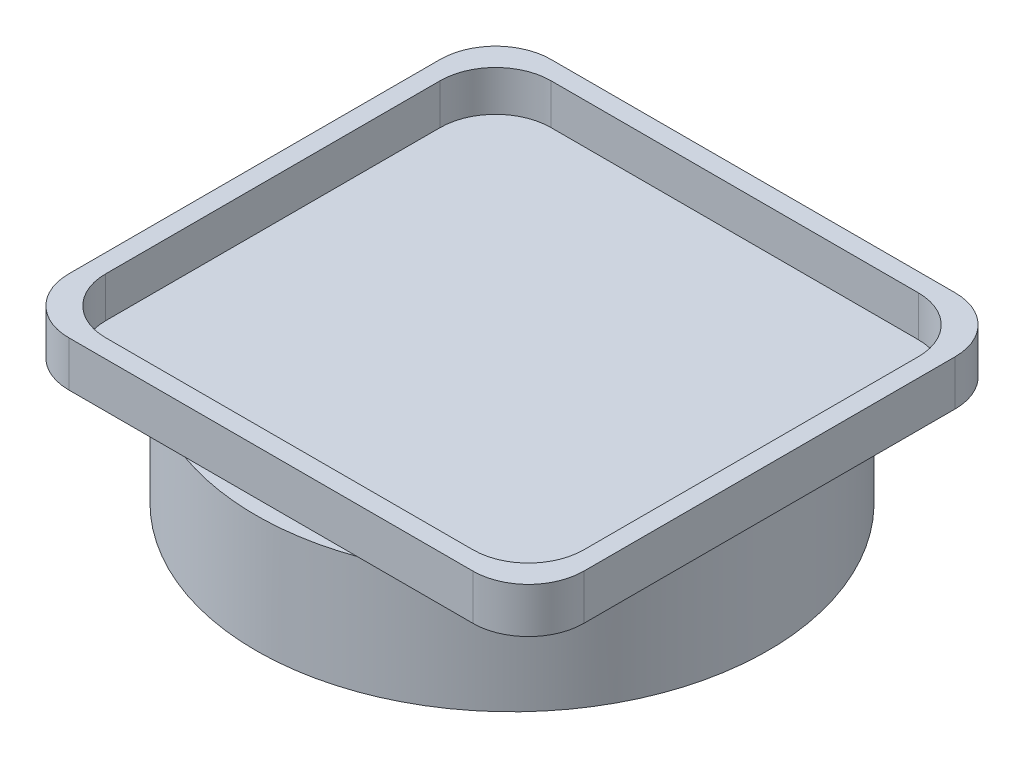
ISO-10303-21;
HEADER;
FILE_DESCRIPTION(('STEP AP214'),'2;1');
FILE_NAME('part.step','',(''),(''),'','','');
FILE_SCHEMA(('AUTOMOTIVE_DESIGN { 1 0 10303 214 1 1 1 1 }'));
ENDSEC;
DATA;
#1=APPLICATION_CONTEXT('core data for automotive mechanical design processes');
#2=APPLICATION_PROTOCOL_DEFINITION('international standard','automotive_design',2000,#1);
#3=PRODUCT_CONTEXT('',#1,'mechanical');
#4=PRODUCT('Part','Part','',(#3));
#5=PRODUCT_RELATED_PRODUCT_CATEGORY('part','',(#4));
#6=PRODUCT_DEFINITION_FORMATION('','',#4);
#7=PRODUCT_DEFINITION_CONTEXT('part definition',#1,'design');
#8=PRODUCT_DEFINITION('design','',#6,#7);
#9=PRODUCT_DEFINITION_SHAPE('','',#8);
#10=(LENGTH_UNIT() NAMED_UNIT(*) SI_UNIT(.MILLI.,.METRE.));
#11=(NAMED_UNIT(*) PLANE_ANGLE_UNIT() SI_UNIT($,.RADIAN.));
#12=(NAMED_UNIT(*) SI_UNIT($,.STERADIAN.) SOLID_ANGLE_UNIT());
#13=UNCERTAINTY_MEASURE_WITH_UNIT(LENGTH_MEASURE(1.E-05),#10,'distance_accuracy_value','');
#14=(GEOMETRIC_REPRESENTATION_CONTEXT(3) GLOBAL_UNCERTAINTY_ASSIGNED_CONTEXT((#13)) GLOBAL_UNIT_ASSIGNED_CONTEXT((#10,
#11,#12)) REPRESENTATION_CONTEXT('',''));
#15=CARTESIAN_POINT('',(0.,0.,0.));
#16=DIRECTION('',(0.,0.,1.));
#17=DIRECTION('',(1.,0.,0.));
#18=AXIS2_PLACEMENT_3D('',#15,#16,#17);
#19=CARTESIAN_POINT('',(10.955,-0.252,10.065));
#20=DIRECTION('',(0.,-1.,0.));
#21=DIRECTION('',(0.,0.,-1.));
#22=AXIS2_PLACEMENT_3D('',#19,#20,#21);
#23=PLANE('',#22);
#24=CARTESIAN_POINT('',(0.,-0.252,0.));
#25=DIRECTION('',(0.,-1.,0.));
#26=DIRECTION('',(0.,0.,-1.));
#27=AXIS2_PLACEMENT_3D('',#24,#25,#26);
#28=CIRCLE('',#27,13.875);
#29=CARTESIAN_POINT('',(4.67133813804996,-0.252,-13.065));
#30=VERTEX_POINT('',#29);
#31=CARTESIAN_POINT('',(4.67133813804995,-0.252,13.065));
#32=VERTEX_POINT('',#31);
#33=EDGE_CURVE('E49',#30,#32,#28,.T.);
#34=ORIENTED_EDGE('',*,*,#33,.F.);
#35=DIRECTION('',(1.,0.,0.));
#36=VECTOR('',#35,1.);
#37=CARTESIAN_POINT('',(-10.955,-0.252,-13.065));
#38=LINE('',#37,#36);
#39=CARTESIAN_POINT('',(10.955,-0.252,-13.065));
#40=VERTEX_POINT('',#39);
#41=EDGE_CURVE('E174',#30,#40,#38,.T.);
#42=ORIENTED_EDGE('',*,*,#41,.T.);
#43=CARTESIAN_POINT('',(10.955,-0.252,-10.065));
#44=DIRECTION('',(0.,-1.,0.));
#45=DIRECTION('',(0.,0.,-1.));
#46=AXIS2_PLACEMENT_3D('',#43,#44,#45);
#47=CIRCLE('',#46,3.);
#48=CARTESIAN_POINT('',(13.955,-0.252,-10.065));
#49=VERTEX_POINT('',#48);
#50=EDGE_CURVE('E171',#40,#49,#47,.T.);
#51=ORIENTED_EDGE('',*,*,#50,.T.);
#52=DIRECTION('',(0.,0.,1.));
#53=VECTOR('',#52,1.);
#54=CARTESIAN_POINT('',(13.955,-0.252,-10.065));
#55=LINE('',#54,#53);
#56=CARTESIAN_POINT('',(13.955,-0.252,10.065));
#57=VERTEX_POINT('',#56);
#58=EDGE_CURVE('E208',#49,#57,#55,.T.);
#59=ORIENTED_EDGE('',*,*,#58,.T.);
#60=CARTESIAN_POINT('',(10.955,-0.252,10.065));
#61=DIRECTION('',(0.,-1.,0.));
#62=DIRECTION('',(0.,0.,-1.));
#63=AXIS2_PLACEMENT_3D('',#60,#61,#62);
#64=CIRCLE('',#63,3.);
#65=CARTESIAN_POINT('',(10.955,-0.252,13.065));
#66=VERTEX_POINT('',#65);
#67=EDGE_CURVE('E193',#57,#66,#64,.T.);
#68=ORIENTED_EDGE('',*,*,#67,.T.);
#69=DIRECTION('',(-1.,0.,0.));
#70=VECTOR('',#69,1.);
#71=CARTESIAN_POINT('',(10.955,-0.252,13.065));
#72=LINE('',#71,#70);
#73=EDGE_CURVE('E197',#66,#32,#72,.T.);
#74=ORIENTED_EDGE('',*,*,#73,.T.);
#75=EDGE_LOOP('',(#34,#42,#51,#59,#68,#74));
#76=FACE_BOUND('',#75,.T.);
#77=ADVANCED_FACE('F39',(#76),#23,.T.);
#78=CARTESIAN_POINT('',(0.,2.2,0.));
#79=DIRECTION('',(0.,-1.,0.));
#80=DIRECTION('',(0.,0.,-1.));
#81=AXIS2_PLACEMENT_3D('',#78,#79,#80);
#82=PLANE('',#81);
#83=DIRECTION('',(0.,0.,1.));
#84=VECTOR('',#83,1.);
#85=CARTESIAN_POINT('',(-13.955,2.2,13.065));
#86=LINE('',#85,#84);
#87=CARTESIAN_POINT('',(-13.955,2.2,-10.065));
#88=VERTEX_POINT('',#87);
#89=CARTESIAN_POINT('',(-13.955,2.2,10.065));
#90=VERTEX_POINT('',#89);
#91=EDGE_CURVE('E225',#88,#90,#86,.T.);
#92=ORIENTED_EDGE('',*,*,#91,.T.);
#93=CARTESIAN_POINT('',(-10.955,2.2,10.065));
#94=DIRECTION('',(0.,-1.,0.));
#95=DIRECTION('',(0.,0.,-1.));
#96=AXIS2_PLACEMENT_3D('',#93,#94,#95);
#97=CIRCLE('',#96,3.);
#98=CARTESIAN_POINT('',(-10.955,2.2,13.065));
#99=VERTEX_POINT('',#98);
#100=EDGE_CURVE('E272',#90,#99,#97,.F.);
#101=ORIENTED_EDGE('',*,*,#100,.T.);
#102=DIRECTION('',(1.,0.,0.));
#103=VECTOR('',#102,1.);
#104=CARTESIAN_POINT('',(-13.955,2.2,13.065));
#105=LINE('',#104,#103);
#106=CARTESIAN_POINT('',(10.955,2.2,13.065));
#107=VERTEX_POINT('',#106);
#108=EDGE_CURVE('E238',#99,#107,#105,.T.);
#109=ORIENTED_EDGE('',*,*,#108,.T.);
#110=CARTESIAN_POINT('',(10.955,2.2,10.065));
#111=DIRECTION('',(0.,-1.,0.));
#112=DIRECTION('',(0.,0.,-1.));
#113=AXIS2_PLACEMENT_3D('',#110,#111,#112);
#114=CIRCLE('',#113,3.);
#115=CARTESIAN_POINT('',(13.955,2.2,10.065));
#116=VERTEX_POINT('',#115);
#117=EDGE_CURVE('E270',#107,#116,#114,.F.);
#118=ORIENTED_EDGE('',*,*,#117,.T.);
#119=DIRECTION('',(0.,0.,-1.));
#120=VECTOR('',#119,1.);
#121=CARTESIAN_POINT('',(13.955,2.2,13.065));
#122=LINE('',#121,#120);
#123=CARTESIAN_POINT('',(13.955,2.2,-10.065));
#124=VERTEX_POINT('',#123);
#125=EDGE_CURVE('E241',#116,#124,#122,.T.);
#126=ORIENTED_EDGE('',*,*,#125,.T.);
#127=CARTESIAN_POINT('',(10.955,2.2,-10.065));
#128=DIRECTION('',(0.,-1.,0.));
#129=DIRECTION('',(0.,0.,-1.));
#130=AXIS2_PLACEMENT_3D('',#127,#128,#129);
#131=CIRCLE('',#130,3.);
#132=CARTESIAN_POINT('',(10.955,2.2,-13.065));
#133=VERTEX_POINT('',#132);
#134=EDGE_CURVE('E268',#124,#133,#131,.F.);
#135=ORIENTED_EDGE('',*,*,#134,.T.);
#136=DIRECTION('',(-1.,0.,0.));
#137=VECTOR('',#136,1.);
#138=CARTESIAN_POINT('',(-13.955,2.2,-13.065));
#139=LINE('',#138,#137);
#140=CARTESIAN_POINT('',(-10.955,2.2,-13.065));
#141=VERTEX_POINT('',#140);
#142=EDGE_CURVE('E244',#133,#141,#139,.T.);
#143=ORIENTED_EDGE('',*,*,#142,.T.);
#144=CARTESIAN_POINT('',(-10.955,2.2,-10.065));
#145=DIRECTION('',(0.,-1.,0.));
#146=DIRECTION('',(0.,0.,-1.));
#147=AXIS2_PLACEMENT_3D('',#144,#145,#146);
#148=CIRCLE('',#147,3.);
#149=EDGE_CURVE('E266',#141,#88,#148,.F.);
#150=ORIENTED_EDGE('',*,*,#149,.T.);
#151=EDGE_LOOP('',(#92,#101,#109,#118,#126,#135,#143,#150));
#152=FACE_BOUND('',#151,.T.);
#153=DIRECTION('',(0.,0.,-1.));
#154=VECTOR('',#153,1.);
#155=CARTESIAN_POINT('',(12.955,2.2,12.065));
#156=LINE('',#155,#154);
#157=CARTESIAN_POINT('',(12.955,2.2,9.065));
#158=VERTEX_POINT('',#157);
#159=CARTESIAN_POINT('',(12.955,2.2,-9.06499999999999));
#160=VERTEX_POINT('',#159);
#161=EDGE_CURVE('E212',#158,#160,#156,.T.);
#162=ORIENTED_EDGE('',*,*,#161,.F.);
#163=CARTESIAN_POINT('',(9.955,2.2,9.065));
#164=DIRECTION('',(0.,-1.,0.));
#165=DIRECTION('',(0.,0.,-1.));
#166=AXIS2_PLACEMENT_3D('',#163,#164,#165);
#167=CIRCLE('',#166,3.);
#168=CARTESIAN_POINT('',(9.95499999999999,2.2,12.065));
#169=VERTEX_POINT('',#168);
#170=EDGE_CURVE('E300',#158,#169,#167,.T.);
#171=ORIENTED_EDGE('',*,*,#170,.T.);
#172=DIRECTION('',(1.,0.,0.));
#173=VECTOR('',#172,1.);
#174=CARTESIAN_POINT('',(-12.955,2.2,12.065));
#175=LINE('',#174,#173);
#176=CARTESIAN_POINT('',(-9.955,2.2,12.065));
#177=VERTEX_POINT('',#176);
#178=EDGE_CURVE('E222',#177,#169,#175,.T.);
#179=ORIENTED_EDGE('',*,*,#178,.F.);
#180=CARTESIAN_POINT('',(-9.955,2.2,9.065));
#181=DIRECTION('',(0.,-1.,0.));
#182=DIRECTION('',(0.,0.,-1.));
#183=AXIS2_PLACEMENT_3D('',#180,#181,#182);
#184=CIRCLE('',#183,3.);
#185=CARTESIAN_POINT('',(-12.955,2.2,9.065));
#186=VERTEX_POINT('',#185);
#187=EDGE_CURVE('E295',#177,#186,#184,.T.);
#188=ORIENTED_EDGE('',*,*,#187,.T.);
#189=DIRECTION('',(0.,0.,1.));
#190=VECTOR('',#189,1.);
#191=CARTESIAN_POINT('',(-12.955,2.2,12.065));
#192=LINE('',#191,#190);
#193=CARTESIAN_POINT('',(-12.955,2.2,-9.06499999999999));
#194=VERTEX_POINT('',#193);
#195=EDGE_CURVE('E219',#194,#186,#192,.T.);
#196=ORIENTED_EDGE('',*,*,#195,.F.);
#197=CARTESIAN_POINT('',(-9.955,2.2,-9.065));
#198=DIRECTION('',(0.,-1.,0.));
#199=DIRECTION('',(0.,0.,-1.));
#200=AXIS2_PLACEMENT_3D('',#197,#198,#199);
#201=CIRCLE('',#200,3.);
#202=CARTESIAN_POINT('',(-9.955,2.2,-12.065));
#203=VERTEX_POINT('',#202);
#204=EDGE_CURVE('E43',#194,#203,#201,.T.);
#205=ORIENTED_EDGE('',*,*,#204,.T.);
#206=DIRECTION('',(-1.,0.,0.));
#207=VECTOR('',#206,1.);
#208=CARTESIAN_POINT('',(-12.955,2.2,-12.065));
#209=LINE('',#208,#207);
#210=CARTESIAN_POINT('',(9.95499999999999,2.2,-12.065));
#211=VERTEX_POINT('',#210);
#212=EDGE_CURVE('E215',#211,#203,#209,.T.);
#213=ORIENTED_EDGE('',*,*,#212,.F.);
#214=CARTESIAN_POINT('',(9.955,2.2,-9.06499999999999));
#215=DIRECTION('',(0.,-1.,0.));
#216=DIRECTION('',(0.,0.,-1.));
#217=AXIS2_PLACEMENT_3D('',#214,#215,#216);
#218=CIRCLE('',#217,3.);
#219=EDGE_CURVE('E305',#211,#160,#218,.T.);
#220=ORIENTED_EDGE('',*,*,#219,.T.);
#221=EDGE_LOOP('',(#162,#171,#179,#188,#196,#205,#213,#220));
#222=FACE_BOUND('',#221,.T.);
#223=ADVANCED_FACE('F314',(#152,#222),#82,.F.);
#224=CARTESIAN_POINT('',(-13.955,2.2,13.065));
#225=DIRECTION('',(1.,0.,0.));
#226=DIRECTION('',(0.,0.,-1.));
#227=AXIS2_PLACEMENT_3D('',#224,#225,#226);
#228=PLANE('',#227);
#229=DIRECTION('',(0.,-1.,0.));
#230=VECTOR('',#229,1.);
#231=CARTESIAN_POINT('',(-13.955,2.2,-10.065));
#232=LINE('',#231,#230);
#233=CARTESIAN_POINT('',(-13.955,-0.252,-10.065));
#234=VERTEX_POINT('',#233);
#235=EDGE_CURVE('E262',#88,#234,#232,.T.);
#236=ORIENTED_EDGE('',*,*,#235,.T.);
#237=DIRECTION('',(0.,0.,-1.));
#238=VECTOR('',#237,1.);
#239=CARTESIAN_POINT('',(-13.955,-0.252,10.065));
#240=LINE('',#239,#238);
#241=CARTESIAN_POINT('',(-13.955,-0.252,10.065));
#242=VERTEX_POINT('',#241);
#243=EDGE_CURVE('E203',#242,#234,#240,.T.);
#244=ORIENTED_EDGE('',*,*,#243,.F.);
#245=DIRECTION('',(0.,-1.,0.));
#246=VECTOR('',#245,1.);
#247=CARTESIAN_POINT('',(-13.955,2.2,10.065));
#248=LINE('',#247,#246);
#249=EDGE_CURVE('E264',#242,#90,#248,.F.);
#250=ORIENTED_EDGE('',*,*,#249,.T.);
#251=ORIENTED_EDGE('',*,*,#91,.F.);
#252=EDGE_LOOP('',(#236,#244,#250,#251));
#253=FACE_BOUND('',#252,.T.);
#254=ADVANCED_FACE('F360',(#253),#228,.F.);
#255=CARTESIAN_POINT('',(-13.955,2.2,13.065));
#256=DIRECTION('',(0.,0.,-1.));
#257=DIRECTION('',(-1.,0.,0.));
#258=AXIS2_PLACEMENT_3D('',#255,#256,#257);
#259=PLANE('',#258);
#260=ORIENTED_EDGE('',*,*,#108,.F.);
#261=DIRECTION('',(0.,-1.,0.));
#262=VECTOR('',#261,1.);
#263=CARTESIAN_POINT('',(-10.955,2.2,13.065));
#264=LINE('',#263,#262);
#265=CARTESIAN_POINT('',(-10.955,-0.252,13.065));
#266=VERTEX_POINT('',#265);
#267=EDGE_CURVE('E259',#99,#266,#264,.T.);
#268=ORIENTED_EDGE('',*,*,#267,.T.);
#269=CARTESIAN_POINT('',(-4.67133813804995,-0.252,13.065));
#270=VERTEX_POINT('',#269);
#271=EDGE_CURVE('E196',#270,#266,#72,.T.);
#272=ORIENTED_EDGE('',*,*,#271,.F.);
#273=EDGE_CURVE('E200',#32,#270,#72,.T.);
#274=ORIENTED_EDGE('',*,*,#273,.F.);
#275=ORIENTED_EDGE('',*,*,#73,.F.);
#276=DIRECTION('',(0.,-1.,0.));
#277=VECTOR('',#276,1.);
#278=CARTESIAN_POINT('',(10.955,2.2,13.065));
#279=LINE('',#278,#277);
#280=EDGE_CURVE('E257',#66,#107,#279,.F.);
#281=ORIENTED_EDGE('',*,*,#280,.T.);
#282=EDGE_LOOP('',(#260,#268,#272,#274,#275,#281));
#283=FACE_BOUND('',#282,.T.);
#284=ADVANCED_FACE('F389',(#283),#259,.F.);
#285=CARTESIAN_POINT('',(13.955,2.2,13.065));
#286=DIRECTION('',(-1.,0.,0.));
#287=DIRECTION('',(0.,0.,1.));
#288=AXIS2_PLACEMENT_3D('',#285,#286,#287);
#289=PLANE('',#288);
#290=ORIENTED_EDGE('',*,*,#125,.F.);
#291=DIRECTION('',(0.,-1.,0.));
#292=VECTOR('',#291,1.);
#293=CARTESIAN_POINT('',(13.955,2.2,10.065));
#294=LINE('',#293,#292);
#295=EDGE_CURVE('E276',#116,#57,#294,.T.);
#296=ORIENTED_EDGE('',*,*,#295,.T.);
#297=ORIENTED_EDGE('',*,*,#58,.F.);
#298=DIRECTION('',(0.,-1.,0.));
#299=VECTOR('',#298,1.);
#300=CARTESIAN_POINT('',(13.955,2.2,-10.065));
#301=LINE('',#300,#299);
#302=EDGE_CURVE('E274',#49,#124,#301,.F.);
#303=ORIENTED_EDGE('',*,*,#302,.T.);
#304=EDGE_LOOP('',(#290,#296,#297,#303));
#305=FACE_BOUND('',#304,.T.);
#306=ADVANCED_FACE('F386',(#305),#289,.F.);
#307=CARTESIAN_POINT('',(-13.955,2.2,-13.065));
#308=DIRECTION('',(0.,0.,1.));
#309=DIRECTION('',(1.,0.,0.));
#310=AXIS2_PLACEMENT_3D('',#307,#308,#309);
#311=PLANE('',#310);
#312=ORIENTED_EDGE('',*,*,#142,.F.);
#313=DIRECTION('',(0.,-1.,0.));
#314=VECTOR('',#313,1.);
#315=CARTESIAN_POINT('',(10.955,2.2,-13.065));
#316=LINE('',#315,#314);
#317=EDGE_CURVE('E290',#133,#40,#316,.T.);
#318=ORIENTED_EDGE('',*,*,#317,.T.);
#319=ORIENTED_EDGE('',*,*,#41,.F.);
#320=CARTESIAN_POINT('',(-4.67133813804996,-0.252,-13.065));
#321=VERTEX_POINT('',#320);
#322=EDGE_CURVE('E172',#321,#30,#38,.T.);
#323=ORIENTED_EDGE('',*,*,#322,.F.);
#324=CARTESIAN_POINT('',(-10.955,-0.252,-13.065));
#325=VERTEX_POINT('',#324);
#326=EDGE_CURVE('E164',#325,#321,#38,.T.);
#327=ORIENTED_EDGE('',*,*,#326,.F.);
#328=DIRECTION('',(0.,-1.,0.));
#329=VECTOR('',#328,1.);
#330=CARTESIAN_POINT('',(-10.955,2.2,-13.065));
#331=LINE('',#330,#329);
#332=EDGE_CURVE('E288',#325,#141,#331,.F.);
#333=ORIENTED_EDGE('',*,*,#332,.T.);
#334=EDGE_LOOP('',(#312,#318,#319,#323,#327,#333));
#335=FACE_BOUND('',#334,.T.);
#336=ADVANCED_FACE('F178',(#335),#311,.F.);
#337=CARTESIAN_POINT('',(12.955,2.2,12.065));
#338=DIRECTION('',(-1.,0.,0.));
#339=DIRECTION('',(0.,0.,1.));
#340=AXIS2_PLACEMENT_3D('',#337,#338,#339);
#341=PLANE('',#340);
#342=DIRECTION('',(0.,0.,-1.));
#343=VECTOR('',#342,1.);
#344=CARTESIAN_POINT('',(12.955,0.,12.065));
#345=LINE('',#344,#343);
#346=CARTESIAN_POINT('',(12.955,0.,9.065));
#347=VERTEX_POINT('',#346);
#348=CARTESIAN_POINT('',(12.955,0.,-9.06499999999999));
#349=VERTEX_POINT('',#348);
#350=EDGE_CURVE('E211',#347,#349,#345,.T.);
#351=ORIENTED_EDGE('',*,*,#350,.F.);
#352=DIRECTION('',(0.,-1.,0.));
#353=VECTOR('',#352,1.);
#354=CARTESIAN_POINT('',(12.955,2.2,9.065));
#355=LINE('',#354,#353);
#356=EDGE_CURVE('E281',#347,#158,#355,.F.);
#357=ORIENTED_EDGE('',*,*,#356,.T.);
#358=ORIENTED_EDGE('',*,*,#161,.T.);
#359=DIRECTION('',(0.,-1.,0.));
#360=VECTOR('',#359,1.);
#361=CARTESIAN_POINT('',(12.955,0.,-9.06499999999999));
#362=LINE('',#361,#360);
#363=EDGE_CURVE('E278',#160,#349,#362,.T.);
#364=ORIENTED_EDGE('',*,*,#363,.T.);
#365=EDGE_LOOP('',(#351,#357,#358,#364));
#366=FACE_BOUND('',#365,.T.);
#367=ADVANCED_FACE('F339',(#366),#341,.T.);
#368=CARTESIAN_POINT('',(-12.955,2.2,-12.065));
#369=DIRECTION('',(0.,0.,1.));
#370=DIRECTION('',(1.,0.,0.));
#371=AXIS2_PLACEMENT_3D('',#368,#369,#370);
#372=PLANE('',#371);
#373=DIRECTION('',(-1.,0.,0.));
#374=VECTOR('',#373,1.);
#375=CARTESIAN_POINT('',(-12.955,0.,-12.065));
#376=LINE('',#375,#374);
#377=CARTESIAN_POINT('',(9.95499999999999,0.,-12.065));
#378=VERTEX_POINT('',#377);
#379=CARTESIAN_POINT('',(-9.955,0.,-12.065));
#380=VERTEX_POINT('',#379);
#381=EDGE_CURVE('E228',#378,#380,#376,.T.);
#382=ORIENTED_EDGE('',*,*,#381,.F.);
#383=DIRECTION('',(0.,-1.,0.));
#384=VECTOR('',#383,1.);
#385=CARTESIAN_POINT('',(9.955,2.2,-12.065));
#386=LINE('',#385,#384);
#387=EDGE_CURVE('E286',#378,#211,#386,.F.);
#388=ORIENTED_EDGE('',*,*,#387,.T.);
#389=ORIENTED_EDGE('',*,*,#212,.T.);
#390=DIRECTION('',(0.,-1.,0.));
#391=VECTOR('',#390,1.);
#392=CARTESIAN_POINT('',(-9.955,0.,-12.065));
#393=LINE('',#392,#391);
#394=EDGE_CURVE('E283',#203,#380,#393,.T.);
#395=ORIENTED_EDGE('',*,*,#394,.T.);
#396=EDGE_LOOP('',(#382,#388,#389,#395));
#397=FACE_BOUND('',#396,.T.);
#398=ADVANCED_FACE('F319',(#397),#372,.T.);
#399=CARTESIAN_POINT('',(-12.955,2.2,12.065));
#400=DIRECTION('',(1.,0.,0.));
#401=DIRECTION('',(0.,0.,-1.));
#402=AXIS2_PLACEMENT_3D('',#399,#400,#401);
#403=PLANE('',#402);
#404=ORIENTED_EDGE('',*,*,#195,.T.);
#405=DIRECTION('',(0.,-1.,0.));
#406=VECTOR('',#405,1.);
#407=CARTESIAN_POINT('',(-12.955,0.,9.065));
#408=LINE('',#407,#406);
#409=CARTESIAN_POINT('',(-12.955,0.,9.065));
#410=VERTEX_POINT('',#409);
#411=EDGE_CURVE('E249',#186,#410,#408,.T.);
#412=ORIENTED_EDGE('',*,*,#411,.T.);
#413=DIRECTION('',(0.,0.,1.));
#414=VECTOR('',#413,1.);
#415=CARTESIAN_POINT('',(-12.955,0.,12.065));
#416=LINE('',#415,#414);
#417=CARTESIAN_POINT('',(-12.955,0.,-9.06499999999999));
#418=VERTEX_POINT('',#417);
#419=EDGE_CURVE('E231',#418,#410,#416,.T.);
#420=ORIENTED_EDGE('',*,*,#419,.F.);
#421=DIRECTION('',(0.,-1.,0.));
#422=VECTOR('',#421,1.);
#423=CARTESIAN_POINT('',(-12.955,2.2,-9.065));
#424=LINE('',#423,#422);
#425=EDGE_CURVE('E247',#418,#194,#424,.F.);
#426=ORIENTED_EDGE('',*,*,#425,.T.);
#427=EDGE_LOOP('',(#404,#412,#420,#426));
#428=FACE_BOUND('',#427,.T.);
#429=ADVANCED_FACE('F323',(#428),#403,.T.);
#430=CARTESIAN_POINT('',(-12.955,2.2,12.065));
#431=DIRECTION('',(0.,0.,-1.));
#432=DIRECTION('',(-1.,0.,0.));
#433=AXIS2_PLACEMENT_3D('',#430,#431,#432);
#434=PLANE('',#433);
#435=DIRECTION('',(1.,0.,0.));
#436=VECTOR('',#435,1.);
#437=CARTESIAN_POINT('',(-12.955,0.,12.065));
#438=LINE('',#437,#436);
#439=CARTESIAN_POINT('',(-9.955,0.,12.065));
#440=VERTEX_POINT('',#439);
#441=CARTESIAN_POINT('',(9.95499999999999,0.,12.065));
#442=VERTEX_POINT('',#441);
#443=EDGE_CURVE('E216',#440,#442,#438,.T.);
#444=ORIENTED_EDGE('',*,*,#443,.F.);
#445=DIRECTION('',(0.,-1.,0.));
#446=VECTOR('',#445,1.);
#447=CARTESIAN_POINT('',(-9.955,2.2,12.065));
#448=LINE('',#447,#446);
#449=EDGE_CURVE('E255',#440,#177,#448,.F.);
#450=ORIENTED_EDGE('',*,*,#449,.T.);
#451=ORIENTED_EDGE('',*,*,#178,.T.);
#452=DIRECTION('',(0.,-1.,0.));
#453=VECTOR('',#452,1.);
#454=CARTESIAN_POINT('',(9.955,0.,12.065));
#455=LINE('',#454,#453);
#456=EDGE_CURVE('E252',#169,#442,#455,.T.);
#457=ORIENTED_EDGE('',*,*,#456,.T.);
#458=EDGE_LOOP('',(#444,#450,#451,#457));
#459=FACE_BOUND('',#458,.T.);
#460=ADVANCED_FACE('F332',(#459),#434,.T.);
#461=CARTESIAN_POINT('',(-9.955,2.2,9.065));
#462=DIRECTION('',(0.,1.,0.));
#463=DIRECTION('',(0.,0.,1.));
#464=AXIS2_PLACEMENT_3D('',#461,#462,#463);
#465=CYLINDRICAL_SURFACE('',#464,3.);
#466=ORIENTED_EDGE('',*,*,#187,.F.);
#467=ORIENTED_EDGE('',*,*,#449,.F.);
#468=CARTESIAN_POINT('',(-9.955,0.,9.065));
#469=DIRECTION('',(0.,-1.,0.));
#470=DIRECTION('',(0.,0.,-1.));
#471=AXIS2_PLACEMENT_3D('',#468,#469,#470);
#472=CIRCLE('',#471,3.);
#473=EDGE_CURVE('E292',#410,#440,#472,.F.);
#474=ORIENTED_EDGE('',*,*,#473,.F.);
#475=ORIENTED_EDGE('',*,*,#411,.F.);
#476=EDGE_LOOP('',(#466,#467,#474,#475));
#477=FACE_BOUND('',#476,.T.);
#478=ADVANCED_FACE('F329',(#477),#465,.F.);
#479=CARTESIAN_POINT('',(-10.955,2.2,10.065));
#480=DIRECTION('',(0.,-1.,0.));
#481=DIRECTION('',(0.,0.,-1.));
#482=AXIS2_PLACEMENT_3D('',#479,#480,#481);
#483=CYLINDRICAL_SURFACE('',#482,3.);
#484=ORIENTED_EDGE('',*,*,#100,.F.);
#485=ORIENTED_EDGE('',*,*,#249,.F.);
#486=CARTESIAN_POINT('',(-10.955,-0.252,10.065));
#487=DIRECTION('',(0.,-1.,0.));
#488=DIRECTION('',(0.,0.,-1.));
#489=AXIS2_PLACEMENT_3D('',#486,#487,#488);
#490=CIRCLE('',#489,3.);
#491=EDGE_CURVE('E199',#266,#242,#490,.T.);
#492=ORIENTED_EDGE('',*,*,#491,.F.);
#493=ORIENTED_EDGE('',*,*,#267,.F.);
#494=EDGE_LOOP('',(#484,#485,#492,#493));
#495=FACE_BOUND('',#494,.T.);
#496=ADVANCED_FACE('F399',(#495),#483,.T.);
#497=CARTESIAN_POINT('',(10.955,2.2,10.065));
#498=DIRECTION('',(0.,-1.,0.));
#499=DIRECTION('',(0.,0.,-1.));
#500=AXIS2_PLACEMENT_3D('',#497,#498,#499);
#501=CYLINDRICAL_SURFACE('',#500,3.);
#502=ORIENTED_EDGE('',*,*,#117,.F.);
#503=ORIENTED_EDGE('',*,*,#280,.F.);
#504=ORIENTED_EDGE('',*,*,#67,.F.);
#505=ORIENTED_EDGE('',*,*,#295,.F.);
#506=EDGE_LOOP('',(#502,#503,#504,#505));
#507=FACE_BOUND('',#506,.T.);
#508=ADVANCED_FACE('F353',(#507),#501,.T.);
#509=CARTESIAN_POINT('',(9.955,2.2,9.065));
#510=DIRECTION('',(0.,1.,0.));
#511=DIRECTION('',(0.,0.,1.));
#512=AXIS2_PLACEMENT_3D('',#509,#510,#511);
#513=CYLINDRICAL_SURFACE('',#512,3.);
#514=ORIENTED_EDGE('',*,*,#170,.F.);
#515=ORIENTED_EDGE('',*,*,#356,.F.);
#516=CARTESIAN_POINT('',(9.955,0.,9.065));
#517=DIRECTION('',(0.,-1.,0.));
#518=DIRECTION('',(0.,0.,-1.));
#519=AXIS2_PLACEMENT_3D('',#516,#517,#518);
#520=CIRCLE('',#519,3.);
#521=EDGE_CURVE('E297',#442,#347,#520,.F.);
#522=ORIENTED_EDGE('',*,*,#521,.F.);
#523=ORIENTED_EDGE('',*,*,#456,.F.);
#524=EDGE_LOOP('',(#514,#515,#522,#523));
#525=FACE_BOUND('',#524,.T.);
#526=ADVANCED_FACE('F337',(#525),#513,.F.);
#527=CARTESIAN_POINT('',(9.955,2.2,-9.06499999999999));
#528=DIRECTION('',(0.,1.,0.));
#529=DIRECTION('',(0.,0.,1.));
#530=AXIS2_PLACEMENT_3D('',#527,#528,#529);
#531=CYLINDRICAL_SURFACE('',#530,3.);
#532=ORIENTED_EDGE('',*,*,#219,.F.);
#533=ORIENTED_EDGE('',*,*,#387,.F.);
#534=CARTESIAN_POINT('',(9.955,0.,-9.06499999999999));
#535=DIRECTION('',(0.,-1.,0.));
#536=DIRECTION('',(0.,0.,-1.));
#537=AXIS2_PLACEMENT_3D('',#534,#535,#536);
#538=CIRCLE('',#537,3.);
#539=EDGE_CURVE('E302',#349,#378,#538,.F.);
#540=ORIENTED_EDGE('',*,*,#539,.F.);
#541=ORIENTED_EDGE('',*,*,#363,.F.);
#542=EDGE_LOOP('',(#532,#533,#540,#541));
#543=FACE_BOUND('',#542,.T.);
#544=ADVANCED_FACE('F342',(#543),#531,.F.);
#545=CARTESIAN_POINT('',(10.955,2.2,-10.065));
#546=DIRECTION('',(0.,-1.,0.));
#547=DIRECTION('',(0.,0.,-1.));
#548=AXIS2_PLACEMENT_3D('',#545,#546,#547);
#549=CYLINDRICAL_SURFACE('',#548,3.);
#550=ORIENTED_EDGE('',*,*,#134,.F.);
#551=ORIENTED_EDGE('',*,*,#302,.F.);
#552=ORIENTED_EDGE('',*,*,#50,.F.);
#553=ORIENTED_EDGE('',*,*,#317,.F.);
#554=EDGE_LOOP('',(#550,#551,#552,#553));
#555=FACE_BOUND('',#554,.T.);
#556=ADVANCED_FACE('F344',(#555),#549,.T.);
#557=CARTESIAN_POINT('',(-10.955,2.2,-10.065));
#558=DIRECTION('',(0.,-1.,0.));
#559=DIRECTION('',(0.,0.,-1.));
#560=AXIS2_PLACEMENT_3D('',#557,#558,#559);
#561=CYLINDRICAL_SURFACE('',#560,3.);
#562=ORIENTED_EDGE('',*,*,#149,.F.);
#563=ORIENTED_EDGE('',*,*,#332,.F.);
#564=CARTESIAN_POINT('',(-10.955,-0.252,-10.065));
#565=DIRECTION('',(0.,-1.,0.));
#566=DIRECTION('',(0.,0.,-1.));
#567=AXIS2_PLACEMENT_3D('',#564,#565,#566);
#568=CIRCLE('',#567,3.);
#569=EDGE_CURVE('E169',#234,#325,#568,.T.);
#570=ORIENTED_EDGE('',*,*,#569,.F.);
#571=ORIENTED_EDGE('',*,*,#235,.F.);
#572=EDGE_LOOP('',(#562,#563,#570,#571));
#573=FACE_BOUND('',#572,.T.);
#574=ADVANCED_FACE('F350',(#573),#561,.T.);
#575=CARTESIAN_POINT('',(-9.955,2.2,-9.065));
#576=DIRECTION('',(0.,1.,0.));
#577=DIRECTION('',(0.,0.,1.));
#578=AXIS2_PLACEMENT_3D('',#575,#576,#577);
#579=CYLINDRICAL_SURFACE('',#578,3.);
#580=ORIENTED_EDGE('',*,*,#204,.F.);
#581=ORIENTED_EDGE('',*,*,#425,.F.);
#582=CARTESIAN_POINT('',(-9.955,0.,-9.065));
#583=DIRECTION('',(0.,-1.,0.));
#584=DIRECTION('',(0.,0.,-1.));
#585=AXIS2_PLACEMENT_3D('',#582,#583,#584);
#586=CIRCLE('',#585,3.);
#587=EDGE_CURVE('E306',#380,#418,#586,.F.);
#588=ORIENTED_EDGE('',*,*,#587,.F.);
#589=ORIENTED_EDGE('',*,*,#394,.F.);
#590=EDGE_LOOP('',(#580,#581,#588,#589));
#591=FACE_BOUND('',#590,.T.);
#592=ADVANCED_FACE('F41',(#591),#579,.F.);
#593=CARTESIAN_POINT('',(10.955,0.,10.065));
#594=DIRECTION('',(0.,-1.,0.));
#595=DIRECTION('',(0.,0.,-1.));
#596=AXIS2_PLACEMENT_3D('',#593,#594,#595);
#597=PLANE('',#596);
#598=ORIENTED_EDGE('',*,*,#587,.T.);
#599=ORIENTED_EDGE('',*,*,#419,.T.);
#600=ORIENTED_EDGE('',*,*,#473,.T.);
#601=ORIENTED_EDGE('',*,*,#443,.T.);
#602=ORIENTED_EDGE('',*,*,#521,.T.);
#603=ORIENTED_EDGE('',*,*,#350,.T.);
#604=ORIENTED_EDGE('',*,*,#539,.T.);
#605=ORIENTED_EDGE('',*,*,#381,.T.);
#606=EDGE_LOOP('',(#598,#599,#600,#601,#602,#603,#604,#605));
#607=FACE_BOUND('',#606,.T.);
#608=ADVANCED_FACE('F325',(#607),#597,.F.);
#609=EDGE_CURVE('E11',#270,#321,#28,.T.);
#610=ORIENTED_EDGE('',*,*,#609,.F.);
#611=ORIENTED_EDGE('',*,*,#271,.T.);
#612=ORIENTED_EDGE('',*,*,#491,.T.);
#613=ORIENTED_EDGE('',*,*,#243,.T.);
#614=ORIENTED_EDGE('',*,*,#569,.T.);
#615=ORIENTED_EDGE('',*,*,#326,.T.);
#616=EDGE_LOOP('',(#610,#611,#612,#613,#614,#615));
#617=FACE_BOUND('',#616,.T.);
#618=ADVANCED_FACE('F166',(#617),#23,.T.);
#619=CARTESIAN_POINT('',(0.,-0.252,0.));
#620=DIRECTION('',(0.,-1.,0.));
#621=DIRECTION('',(0.,0.,-1.));
#622=AXIS2_PLACEMENT_3D('',#619,#620,#621);
#623=PLANE('',#622);
#624=EDGE_CURVE('E50',#32,#270,#28,.T.);
#625=ORIENTED_EDGE('',*,*,#624,.F.);
#626=ORIENTED_EDGE('',*,*,#273,.T.);
#627=EDGE_LOOP('',(#625,#626));
#628=FACE_BOUND('',#627,.T.);
#629=ADVANCED_FACE('F366',(#628),#623,.F.);
#630=EDGE_CURVE('E182',#321,#30,#28,.T.);
#631=ORIENTED_EDGE('',*,*,#630,.F.);
#632=ORIENTED_EDGE('',*,*,#322,.T.);
#633=EDGE_LOOP('',(#631,#632));
#634=FACE_BOUND('',#633,.T.);
#635=ADVANCED_FACE('F183',(#634),#623,.F.);
#636=CARTESIAN_POINT('',(0.,-6.602,0.));
#637=DIRECTION('',(0.,1.,0.));
#638=DIRECTION('',(0.,0.,1.));
#639=AXIS2_PLACEMENT_3D('',#636,#637,#638);
#640=CYLINDRICAL_SURFACE('',#639,13.875);
#641=CARTESIAN_POINT('',(0.,-6.602,0.));
#642=DIRECTION('',(0.,-1.,0.));
#643=DIRECTION('',(0.,0.,-1.));
#644=AXIS2_PLACEMENT_3D('',#641,#642,#643);
#645=CIRCLE('',#644,13.875);
#646=CARTESIAN_POINT('',(0.,-6.602,-13.875));
#647=VERTEX_POINT('',#646);
#648=EDGE_CURVE('E190',#647,#647,#645,.T.);
#649=ORIENTED_EDGE('',*,*,#648,.F.);
#650=EDGE_LOOP('',(#649));
#651=FACE_BOUND('',#650,.T.);
#652=ORIENTED_EDGE('',*,*,#33,.T.);
#653=ORIENTED_EDGE('',*,*,#624,.T.);
#654=ORIENTED_EDGE('',*,*,#609,.T.);
#655=ORIENTED_EDGE('',*,*,#630,.T.);
#656=EDGE_LOOP('',(#652,#653,#654,#655));
#657=FACE_BOUND('',#656,.T.);
#658=ADVANCED_FACE('F186',(#651,#657),#640,.T.);
#659=CARTESIAN_POINT('',(0.,-6.602,0.));
#660=DIRECTION('',(0.,-1.,0.));
#661=DIRECTION('',(0.,0.,-1.));
#662=AXIS2_PLACEMENT_3D('',#659,#660,#661);
#663=PLANE('',#662);
#664=ORIENTED_EDGE('',*,*,#648,.T.);
#665=EDGE_LOOP('',(#664));
#666=FACE_BOUND('',#665,.T.);
#667=ADVANCED_FACE('F486',(#666),#663,.T.);
#668=CLOSED_SHELL('',(#77,#223,#254,#284,#306,#336,#367,#398,#429,#460,#478,#496,#508,#526,#544,
#556,#574,#592,#608,#618,#629,#635,#658,#667));
#669=MANIFOLD_SOLID_BREP('B2',#668);
#670=ADVANCED_BREP_SHAPE_REPRESENTATION('',(#18,#669),#14);
#671=SHAPE_DEFINITION_REPRESENTATION(#9,#670);
ENDSEC;
END-ISO-10303-21;
